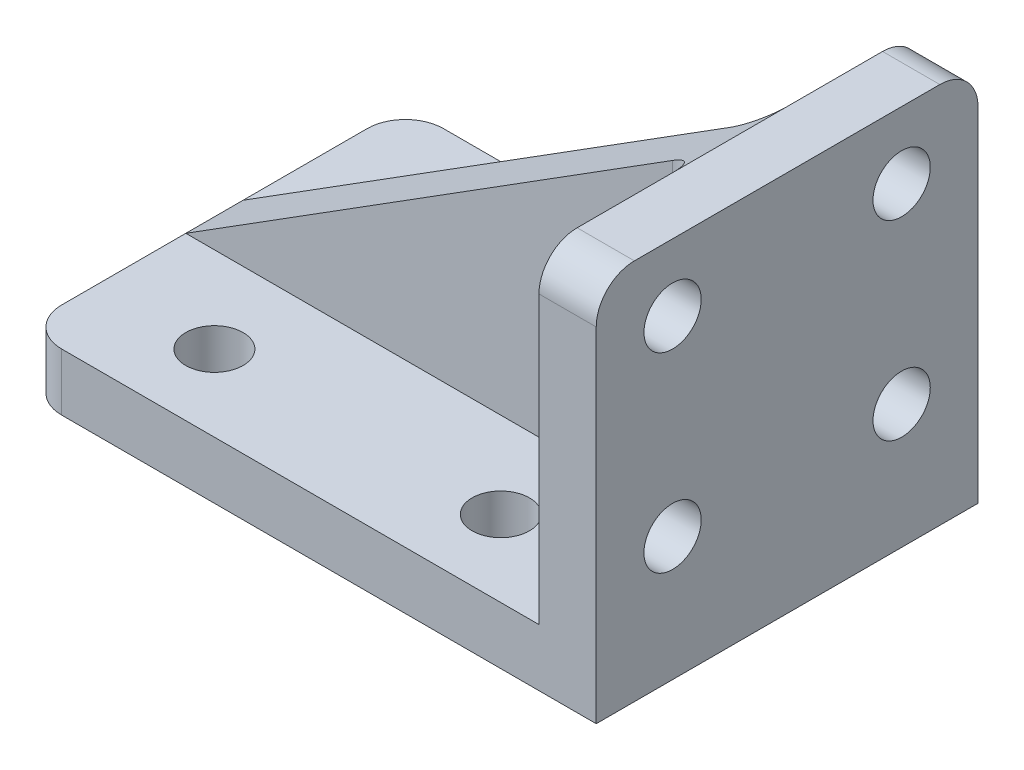
ISO-10303-21;
HEADER;
FILE_DESCRIPTION(('STEP AP214'),'2;1');
FILE_NAME('part.step','',(''),(''),'','','');
FILE_SCHEMA(('AUTOMOTIVE_DESIGN { 1 0 10303 214 1 1 1 1 }'));
ENDSEC;
DATA;
#1=APPLICATION_CONTEXT('core data for automotive mechanical design processes');
#2=APPLICATION_PROTOCOL_DEFINITION('international standard','automotive_design',2000,#1);
#3=PRODUCT_CONTEXT('',#1,'mechanical');
#4=PRODUCT('Part','Part','',(#3));
#5=PRODUCT_RELATED_PRODUCT_CATEGORY('part','',(#4));
#6=PRODUCT_DEFINITION_FORMATION('','',#4);
#7=PRODUCT_DEFINITION_CONTEXT('part definition',#1,'design');
#8=PRODUCT_DEFINITION('design','',#6,#7);
#9=PRODUCT_DEFINITION_SHAPE('','',#8);
#10=(LENGTH_UNIT() NAMED_UNIT(*) SI_UNIT(.MILLI.,.METRE.));
#11=(NAMED_UNIT(*) PLANE_ANGLE_UNIT() SI_UNIT($,.RADIAN.));
#12=(NAMED_UNIT(*) SI_UNIT($,.STERADIAN.) SOLID_ANGLE_UNIT());
#13=UNCERTAINTY_MEASURE_WITH_UNIT(LENGTH_MEASURE(1.E-05),#10,'distance_accuracy_value','');
#14=(GEOMETRIC_REPRESENTATION_CONTEXT(3) GLOBAL_UNCERTAINTY_ASSIGNED_CONTEXT((#13)) GLOBAL_UNIT_ASSIGNED_CONTEXT((#10,
#11,#12)) REPRESENTATION_CONTEXT('',''));
#15=CARTESIAN_POINT('',(0.,0.,0.));
#16=DIRECTION('',(0.,0.,1.));
#17=DIRECTION('',(1.,0.,0.));
#18=AXIS2_PLACEMENT_3D('',#15,#16,#17);
#19=CARTESIAN_POINT('',(0.,3.,0.));
#20=DIRECTION('',(0.,-1.,0.));
#21=DIRECTION('',(0.,0.,-1.));
#22=AXIS2_PLACEMENT_3D('',#19,#20,#21);
#23=PLANE('',#22);
#24=CARTESIAN_POINT('',(6.,3.,-4.));
#25=DIRECTION('',(0.,1.,0.));
#26=DIRECTION('',(0.,0.,-1.));
#27=AXIS2_PLACEMENT_3D('',#24,#25,#26);
#28=CIRCLE('',#27,1.5);
#29=CARTESIAN_POINT('',(6.,3.,-5.5));
#30=VERTEX_POINT('',#29);
#31=EDGE_CURVE('E356',#30,#30,#28,.T.);
#32=ORIENTED_EDGE('',*,*,#31,.F.);
#33=EDGE_LOOP('',(#32));
#34=FACE_BOUND('',#33,.T.);
#35=CARTESIAN_POINT('',(21.,3.,-4.));
#36=DIRECTION('',(0.,1.,0.));
#37=DIRECTION('',(0.,0.,1.));
#38=AXIS2_PLACEMENT_3D('',#35,#36,#37);
#39=CIRCLE('',#38,1.5);
#40=CARTESIAN_POINT('',(21.,3.,-2.5));
#41=VERTEX_POINT('',#40);
#42=EDGE_CURVE('E363',#41,#41,#39,.T.);
#43=ORIENTED_EDGE('',*,*,#42,.F.);
#44=EDGE_LOOP('',(#43));
#45=FACE_BOUND('',#44,.T.);
#46=DIRECTION('',(0.,0.,1.));
#47=VECTOR('',#46,1.);
#48=CARTESIAN_POINT('',(0.,3.,0.));
#49=LINE('',#48,#47);
#50=CARTESIAN_POINT('',(0.,3.,-8.5));
#51=VERTEX_POINT('',#50);
#52=CARTESIAN_POINT('',(0.,3.,-2.));
#53=VERTEX_POINT('',#52);
#54=EDGE_CURVE('E166',#51,#53,#49,.T.);
#55=ORIENTED_EDGE('',*,*,#54,.T.);
#56=CARTESIAN_POINT('',(2.,3.,-2.));
#57=DIRECTION('',(0.,-1.,0.));
#58=DIRECTION('',(0.,0.,-1.));
#59=AXIS2_PLACEMENT_3D('',#56,#57,#58);
#60=CIRCLE('',#59,2.);
#61=CARTESIAN_POINT('',(2.,3.,0.));
#62=VERTEX_POINT('',#61);
#63=EDGE_CURVE('E11',#53,#62,#60,.F.);
#64=ORIENTED_EDGE('',*,*,#63,.T.);
#65=DIRECTION('',(1.,0.,0.));
#66=VECTOR('',#65,1.);
#67=CARTESIAN_POINT('',(0.,3.,0.));
#68=LINE('',#67,#66);
#69=CARTESIAN_POINT('',(27.,3.,0.));
#70=VERTEX_POINT('',#69);
#71=EDGE_CURVE('E176',#62,#70,#68,.T.);
#72=ORIENTED_EDGE('',*,*,#71,.T.);
#73=DIRECTION('',(0.,0.,-1.));
#74=VECTOR('',#73,1.);
#75=CARTESIAN_POINT('',(27.,3.,0.));
#76=LINE('',#75,#74);
#77=CARTESIAN_POINT('',(27.,3.,-7.));
#78=VERTEX_POINT('',#77);
#79=EDGE_CURVE('E276',#70,#78,#76,.T.);
#80=ORIENTED_EDGE('',*,*,#79,.T.);
#81=CARTESIAN_POINT('',(25.5,3.,-7.));
#82=DIRECTION('',(0.,-1.,0.));
#83=DIRECTION('',(0.,0.,-1.));
#84=AXIS2_PLACEMENT_3D('',#81,#82,#83);
#85=CIRCLE('',#84,1.5);
#86=CARTESIAN_POINT('',(25.5,3.,-8.5));
#87=VERTEX_POINT('',#86);
#88=EDGE_CURVE('E170',#78,#87,#85,.F.);
#89=ORIENTED_EDGE('',*,*,#88,.T.);
#90=DIRECTION('',(1.,0.,0.));
#91=VECTOR('',#90,1.);
#92=CARTESIAN_POINT('',(0.,3.,-8.5));
#93=LINE('',#92,#91);
#94=EDGE_CURVE('E148',#51,#87,#93,.T.);
#95=ORIENTED_EDGE('',*,*,#94,.F.);
#96=EDGE_LOOP('',(#55,#64,#72,#80,#89,#95));
#97=FACE_BOUND('',#96,.T.);
#98=ADVANCED_FACE('F35',(#34,#45,#97),#23,.F.);
#99=CARTESIAN_POINT('',(27.,0.,0.));
#100=DIRECTION('',(-1.,0.,0.));
#101=DIRECTION('',(0.,0.,1.));
#102=AXIS2_PLACEMENT_3D('',#99,#100,#101);
#103=PLANE('',#102);
#104=CARTESIAN_POINT('',(27.,16.5,-4.));
#105=DIRECTION('',(-1.,0.,0.));
#106=DIRECTION('',(0.,0.,-1.));
#107=AXIS2_PLACEMENT_3D('',#104,#105,#106);
#108=CIRCLE('',#107,1.5);
#109=CARTESIAN_POINT('',(27.,16.5,-5.5));
#110=VERTEX_POINT('',#109);
#111=EDGE_CURVE('E376',#110,#110,#108,.T.);
#112=ORIENTED_EDGE('',*,*,#111,.F.);
#113=EDGE_LOOP('',(#112));
#114=FACE_BOUND('',#113,.T.);
#115=CARTESIAN_POINT('',(27.,6.5,-4.));
#116=DIRECTION('',(-1.,0.,0.));
#117=DIRECTION('',(0.,0.,1.));
#118=AXIS2_PLACEMENT_3D('',#115,#116,#117);
#119=CIRCLE('',#118,1.5);
#120=CARTESIAN_POINT('',(27.,6.5,-2.5));
#121=VERTEX_POINT('',#120);
#122=EDGE_CURVE('E382',#121,#121,#119,.T.);
#123=ORIENTED_EDGE('',*,*,#122,.F.);
#124=EDGE_LOOP('',(#123));
#125=FACE_BOUND('',#124,.T.);
#126=DIRECTION('',(0.,-1.,0.));
#127=VECTOR('',#126,1.);
#128=CARTESIAN_POINT('',(27.,3.,0.));
#129=LINE('',#128,#127);
#130=CARTESIAN_POINT('',(27.,18.,0.));
#131=VERTEX_POINT('',#130);
#132=EDGE_CURVE('E277',#131,#70,#129,.T.);
#133=ORIENTED_EDGE('',*,*,#132,.F.);
#134=CARTESIAN_POINT('',(27.,18.,-2.));
#135=DIRECTION('',(-1.,0.,0.));
#136=DIRECTION('',(0.,0.,1.));
#137=AXIS2_PLACEMENT_3D('',#134,#135,#136);
#138=CIRCLE('',#137,2.);
#139=CARTESIAN_POINT('',(27.,20.,-2.));
#140=VERTEX_POINT('',#139);
#141=EDGE_CURVE('E234',#131,#140,#138,.T.);
#142=ORIENTED_EDGE('',*,*,#141,.T.);
#143=DIRECTION('',(0.,0.,1.));
#144=VECTOR('',#143,1.);
#145=CARTESIAN_POINT('',(27.,20.,0.));
#146=LINE('',#145,#144);
#147=CARTESIAN_POINT('',(27.,20.,-7.));
#148=VERTEX_POINT('',#147);
#149=EDGE_CURVE('E283',#148,#140,#146,.T.);
#150=ORIENTED_EDGE('',*,*,#149,.F.);
#151=DIRECTION('',(0.,1.,0.));
#152=VECTOR('',#151,1.);
#153=CARTESIAN_POINT('',(27.,0.,-7.));
#154=LINE('',#153,#152);
#155=EDGE_CURVE('E199',#148,#78,#154,.F.);
#156=ORIENTED_EDGE('',*,*,#155,.T.);
#157=ORIENTED_EDGE('',*,*,#79,.F.);
#158=EDGE_LOOP('',(#133,#142,#150,#156,#157));
#159=FACE_BOUND('',#158,.T.);
#160=ADVANCED_FACE('F320',(#114,#125,#159),#103,.T.);
#161=CARTESIAN_POINT('',(0.,3.,0.));
#162=DIRECTION('',(1.,0.,0.));
#163=DIRECTION('',(0.,0.,-1.));
#164=AXIS2_PLACEMENT_3D('',#161,#162,#163);
#165=PLANE('',#164);
#166=CARTESIAN_POINT('',(0.,3.,-18.));
#167=VERTEX_POINT('',#166);
#168=CARTESIAN_POINT('',(0.,3.,-11.5));
#169=VERTEX_POINT('',#168);
#170=EDGE_CURVE('E173',#167,#169,#49,.T.);
#171=ORIENTED_EDGE('',*,*,#170,.F.);
#172=DIRECTION('',(0.,-1.,0.));
#173=VECTOR('',#172,1.);
#174=CARTESIAN_POINT('',(0.,3.,-18.));
#175=LINE('',#174,#173);
#176=CARTESIAN_POINT('',(0.,0.,-18.));
#177=VERTEX_POINT('',#176);
#178=EDGE_CURVE('E237',#167,#177,#175,.T.);
#179=ORIENTED_EDGE('',*,*,#178,.T.);
#180=DIRECTION('',(0.,0.,1.));
#181=VECTOR('',#180,1.);
#182=CARTESIAN_POINT('',(0.,0.,0.));
#183=LINE('',#182,#181);
#184=CARTESIAN_POINT('',(0.,0.,-2.));
#185=VERTEX_POINT('',#184);
#186=EDGE_CURVE('E187',#177,#185,#183,.T.);
#187=ORIENTED_EDGE('',*,*,#186,.T.);
#188=DIRECTION('',(0.,-1.,0.));
#189=VECTOR('',#188,1.);
#190=CARTESIAN_POINT('',(0.,3.,-2.));
#191=LINE('',#190,#189);
#192=EDGE_CURVE('E57',#185,#53,#191,.F.);
#193=ORIENTED_EDGE('',*,*,#192,.T.);
#194=ORIENTED_EDGE('',*,*,#54,.F.);
#195=DIRECTION('',(0.,0.,1.));
#196=VECTOR('',#195,1.);
#197=CARTESIAN_POINT('',(0.,3.,-11.5));
#198=LINE('',#197,#196);
#199=EDGE_CURVE('E157',#169,#51,#198,.T.);
#200=ORIENTED_EDGE('',*,*,#199,.F.);
#201=EDGE_LOOP('',(#171,#179,#187,#193,#194,#200));
#202=FACE_BOUND('',#201,.T.);
#203=ADVANCED_FACE('F172',(#202),#165,.F.);
#204=CARTESIAN_POINT('',(0.,3.,0.));
#205=DIRECTION('',(0.,0.,-1.));
#206=DIRECTION('',(-1.,0.,0.));
#207=AXIS2_PLACEMENT_3D('',#204,#205,#206);
#208=PLANE('',#207);
#209=DIRECTION('',(0.,-1.,0.));
#210=VECTOR('',#209,1.);
#211=CARTESIAN_POINT('',(30.,3.,0.));
#212=LINE('',#211,#210);
#213=CARTESIAN_POINT('',(30.,18.,0.));
#214=VERTEX_POINT('',#213);
#215=CARTESIAN_POINT('',(30.,0.,0.));
#216=VERTEX_POINT('',#215);
#217=EDGE_CURVE('E195',#214,#216,#212,.T.);
#218=ORIENTED_EDGE('',*,*,#217,.F.);
#219=DIRECTION('',(1.,0.,0.));
#220=VECTOR('',#219,1.);
#221=CARTESIAN_POINT('',(27.,18.,0.));
#222=LINE('',#221,#220);
#223=EDGE_CURVE('E232',#214,#131,#222,.F.);
#224=ORIENTED_EDGE('',*,*,#223,.T.);
#225=ORIENTED_EDGE('',*,*,#132,.T.);
#226=ORIENTED_EDGE('',*,*,#71,.F.);
#227=DIRECTION('',(0.,-1.,0.));
#228=VECTOR('',#227,1.);
#229=CARTESIAN_POINT('',(2.,3.,0.));
#230=LINE('',#229,#228);
#231=CARTESIAN_POINT('',(2.,0.,0.));
#232=VERTEX_POINT('',#231);
#233=EDGE_CURVE('E229',#62,#232,#230,.T.);
#234=ORIENTED_EDGE('',*,*,#233,.T.);
#235=DIRECTION('',(1.,0.,0.));
#236=VECTOR('',#235,1.);
#237=CARTESIAN_POINT('',(0.,0.,0.));
#238=LINE('',#237,#236);
#239=EDGE_CURVE('E189',#232,#216,#238,.T.);
#240=ORIENTED_EDGE('',*,*,#239,.T.);
#241=EDGE_LOOP('',(#218,#224,#225,#226,#234,#240));
#242=FACE_BOUND('',#241,.T.);
#243=ADVANCED_FACE('F301',(#242),#208,.F.);
#244=CARTESIAN_POINT('',(30.,3.,0.));
#245=DIRECTION('',(-1.,0.,0.));
#246=DIRECTION('',(0.,0.,1.));
#247=AXIS2_PLACEMENT_3D('',#244,#245,#246);
#248=PLANE('',#247);
#249=CARTESIAN_POINT('',(30.,16.5,-4.));
#250=DIRECTION('',(-1.,0.,0.));
#251=DIRECTION('',(0.,0.,-1.));
#252=AXIS2_PLACEMENT_3D('',#249,#250,#251);
#253=CIRCLE('',#252,1.5);
#254=CARTESIAN_POINT('',(30.,16.5,-5.5));
#255=VERTEX_POINT('',#254);
#256=EDGE_CURVE('E379',#255,#255,#253,.T.);
#257=ORIENTED_EDGE('',*,*,#256,.T.);
#258=EDGE_LOOP('',(#257));
#259=FACE_BOUND('',#258,.T.);
#260=CARTESIAN_POINT('',(30.,6.5,-4.));
#261=DIRECTION('',(-1.,0.,0.));
#262=DIRECTION('',(0.,0.,1.));
#263=AXIS2_PLACEMENT_3D('',#260,#261,#262);
#264=CIRCLE('',#263,1.5);
#265=CARTESIAN_POINT('',(30.,6.5,-2.5));
#266=VERTEX_POINT('',#265);
#267=EDGE_CURVE('E385',#266,#266,#264,.T.);
#268=ORIENTED_EDGE('',*,*,#267,.T.);
#269=EDGE_LOOP('',(#268));
#270=FACE_BOUND('',#269,.T.);
#271=CARTESIAN_POINT('',(30.,6.5,-16.));
#272=DIRECTION('',(-1.,0.,0.));
#273=DIRECTION('',(0.,0.,-1.));
#274=AXIS2_PLACEMENT_3D('',#271,#272,#273);
#275=CIRCLE('',#274,1.5);
#276=CARTESIAN_POINT('',(30.,6.5,-17.5));
#277=VERTEX_POINT('',#276);
#278=EDGE_CURVE('E373',#277,#277,#275,.T.);
#279=ORIENTED_EDGE('',*,*,#278,.T.);
#280=EDGE_LOOP('',(#279));
#281=FACE_BOUND('',#280,.T.);
#282=CARTESIAN_POINT('',(30.,16.5,-16.));
#283=DIRECTION('',(-1.,0.,0.));
#284=DIRECTION('',(0.,0.,1.));
#285=AXIS2_PLACEMENT_3D('',#282,#283,#284);
#286=CIRCLE('',#285,1.5);
#287=CARTESIAN_POINT('',(30.,16.5,-14.5));
#288=VERTEX_POINT('',#287);
#289=EDGE_CURVE('E360',#288,#288,#286,.T.);
#290=ORIENTED_EDGE('',*,*,#289,.T.);
#291=EDGE_LOOP('',(#290));
#292=FACE_BOUND('',#291,.T.);
#293=DIRECTION('',(0.,-1.,0.));
#294=VECTOR('',#293,1.);
#295=CARTESIAN_POINT('',(30.,3.,-20.));
#296=LINE('',#295,#294);
#297=CARTESIAN_POINT('',(30.,18.,-20.));
#298=VERTEX_POINT('',#297);
#299=CARTESIAN_POINT('',(30.,0.,-20.));
#300=VERTEX_POINT('',#299);
#301=EDGE_CURVE('E186',#298,#300,#296,.T.);
#302=ORIENTED_EDGE('',*,*,#301,.F.);
#303=CARTESIAN_POINT('',(30.,18.,-18.));
#304=DIRECTION('',(-1.,0.,0.));
#305=DIRECTION('',(0.,0.,1.));
#306=AXIS2_PLACEMENT_3D('',#303,#304,#305);
#307=CIRCLE('',#306,2.);
#308=CARTESIAN_POINT('',(30.,20.,-18.));
#309=VERTEX_POINT('',#308);
#310=EDGE_CURVE('E220',#298,#309,#307,.F.);
#311=ORIENTED_EDGE('',*,*,#310,.T.);
#312=DIRECTION('',(0.,0.,1.));
#313=VECTOR('',#312,1.);
#314=CARTESIAN_POINT('',(30.,20.,0.));
#315=LINE('',#314,#313);
#316=CARTESIAN_POINT('',(30.,20.,-2.));
#317=VERTEX_POINT('',#316);
#318=EDGE_CURVE('E162',#309,#317,#315,.T.);
#319=ORIENTED_EDGE('',*,*,#318,.T.);
#320=CARTESIAN_POINT('',(30.,18.,-2.));
#321=DIRECTION('',(-1.,0.,0.));
#322=DIRECTION('',(0.,0.,1.));
#323=AXIS2_PLACEMENT_3D('',#320,#321,#322);
#324=CIRCLE('',#323,2.);
#325=EDGE_CURVE('E218',#317,#214,#324,.F.);
#326=ORIENTED_EDGE('',*,*,#325,.T.);
#327=ORIENTED_EDGE('',*,*,#217,.T.);
#328=DIRECTION('',(0.,0.,-1.));
#329=VECTOR('',#328,1.);
#330=CARTESIAN_POINT('',(30.,0.,0.));
#331=LINE('',#330,#329);
#332=EDGE_CURVE('E178',#216,#300,#331,.T.);
#333=ORIENTED_EDGE('',*,*,#332,.T.);
#334=EDGE_LOOP('',(#302,#311,#319,#326,#327,#333));
#335=FACE_BOUND('',#334,.T.);
#336=ADVANCED_FACE('F299',(#259,#270,#281,#292,#335),#248,.F.);
#337=CARTESIAN_POINT('',(0.,3.,-20.));
#338=DIRECTION('',(0.,0.,1.));
#339=DIRECTION('',(1.,0.,0.));
#340=AXIS2_PLACEMENT_3D('',#337,#338,#339);
#341=PLANE('',#340);
#342=DIRECTION('',(0.,1.,0.));
#343=VECTOR('',#342,1.);
#344=CARTESIAN_POINT('',(27.,3.,-20.));
#345=LINE('',#344,#343);
#346=CARTESIAN_POINT('',(27.,3.,-20.));
#347=VERTEX_POINT('',#346);
#348=CARTESIAN_POINT('',(27.,18.,-20.));
#349=VERTEX_POINT('',#348);
#350=EDGE_CURVE('E275',#347,#349,#345,.T.);
#351=ORIENTED_EDGE('',*,*,#350,.T.);
#352=DIRECTION('',(1.,0.,0.));
#353=VECTOR('',#352,1.);
#354=CARTESIAN_POINT('',(30.,18.,-20.));
#355=LINE('',#354,#353);
#356=EDGE_CURVE('E215',#349,#298,#355,.T.);
#357=ORIENTED_EDGE('',*,*,#356,.T.);
#358=ORIENTED_EDGE('',*,*,#301,.T.);
#359=DIRECTION('',(-1.,0.,0.));
#360=VECTOR('',#359,1.);
#361=CARTESIAN_POINT('',(0.,0.,-20.));
#362=LINE('',#361,#360);
#363=CARTESIAN_POINT('',(2.,0.,-20.));
#364=VERTEX_POINT('',#363);
#365=EDGE_CURVE('E174',#300,#364,#362,.T.);
#366=ORIENTED_EDGE('',*,*,#365,.T.);
#367=DIRECTION('',(0.,-1.,0.));
#368=VECTOR('',#367,1.);
#369=CARTESIAN_POINT('',(2.,3.,-20.));
#370=LINE('',#369,#368);
#371=CARTESIAN_POINT('',(2.,3.,-20.));
#372=VERTEX_POINT('',#371);
#373=EDGE_CURVE('E213',#364,#372,#370,.F.);
#374=ORIENTED_EDGE('',*,*,#373,.T.);
#375=DIRECTION('',(-1.,0.,0.));
#376=VECTOR('',#375,1.);
#377=CARTESIAN_POINT('',(0.,3.,-20.));
#378=LINE('',#377,#376);
#379=EDGE_CURVE('E184',#347,#372,#378,.T.);
#380=ORIENTED_EDGE('',*,*,#379,.F.);
#381=EDGE_LOOP('',(#351,#357,#358,#366,#374,#380));
#382=FACE_BOUND('',#381,.T.);
#383=ADVANCED_FACE('F253',(#382),#341,.F.);
#384=CARTESIAN_POINT('',(21.,3.,-16.));
#385=DIRECTION('',(0.,1.,0.));
#386=DIRECTION('',(0.,0.,-1.));
#387=AXIS2_PLACEMENT_3D('',#384,#385,#386);
#388=CIRCLE('',#387,1.5);
#389=CARTESIAN_POINT('',(21.,3.,-17.5));
#390=VERTEX_POINT('',#389);
#391=EDGE_CURVE('E343',#390,#390,#388,.T.);
#392=ORIENTED_EDGE('',*,*,#391,.F.);
#393=EDGE_LOOP('',(#392));
#394=FACE_BOUND('',#393,.T.);
#395=CARTESIAN_POINT('',(6.,3.,-16.));
#396=DIRECTION('',(0.,1.,0.));
#397=DIRECTION('',(0.,0.,1.));
#398=AXIS2_PLACEMENT_3D('',#395,#396,#397);
#399=CIRCLE('',#398,1.5);
#400=CARTESIAN_POINT('',(6.,3.,-14.5));
#401=VERTEX_POINT('',#400);
#402=EDGE_CURVE('E346',#401,#401,#399,.T.);
#403=ORIENTED_EDGE('',*,*,#402,.F.);
#404=EDGE_LOOP('',(#403));
#405=FACE_BOUND('',#404,.T.);
#406=ORIENTED_EDGE('',*,*,#379,.T.);
#407=CARTESIAN_POINT('',(2.,3.,-18.));
#408=DIRECTION('',(0.,-1.,0.));
#409=DIRECTION('',(0.,0.,-1.));
#410=AXIS2_PLACEMENT_3D('',#407,#408,#409);
#411=CIRCLE('',#410,2.);
#412=EDGE_CURVE('E43',#372,#167,#411,.F.);
#413=ORIENTED_EDGE('',*,*,#412,.T.);
#414=ORIENTED_EDGE('',*,*,#170,.T.);
#415=DIRECTION('',(1.,0.,0.));
#416=VECTOR('',#415,1.);
#417=CARTESIAN_POINT('',(0.,3.,-11.5));
#418=LINE('',#417,#416);
#419=CARTESIAN_POINT('',(25.5,3.,-11.5));
#420=VERTEX_POINT('',#419);
#421=EDGE_CURVE('E259',#169,#420,#418,.T.);
#422=ORIENTED_EDGE('',*,*,#421,.T.);
#423=CARTESIAN_POINT('',(25.5,3.,-13.));
#424=DIRECTION('',(0.,-1.,0.));
#425=DIRECTION('',(0.,0.,-1.));
#426=AXIS2_PLACEMENT_3D('',#423,#424,#425);
#427=CIRCLE('',#426,1.5);
#428=CARTESIAN_POINT('',(27.,3.,-13.));
#429=VERTEX_POINT('',#428);
#430=EDGE_CURVE('E207',#420,#429,#427,.F.);
#431=ORIENTED_EDGE('',*,*,#430,.T.);
#432=EDGE_CURVE('E274',#429,#347,#76,.T.);
#433=ORIENTED_EDGE('',*,*,#432,.T.);
#434=EDGE_LOOP('',(#406,#413,#414,#422,#431,#433));
#435=FACE_BOUND('',#434,.T.);
#436=ADVANCED_FACE('F258',(#394,#405,#435),#23,.F.);
#437=CARTESIAN_POINT('',(0.,0.,0.));
#438=DIRECTION('',(0.,-1.,0.));
#439=DIRECTION('',(0.,0.,-1.));
#440=AXIS2_PLACEMENT_3D('',#437,#438,#439);
#441=PLANE('',#440);
#442=CARTESIAN_POINT('',(6.,0.,-4.));
#443=DIRECTION('',(0.,1.,0.));
#444=DIRECTION('',(0.,0.,-1.));
#445=AXIS2_PLACEMENT_3D('',#442,#443,#444);
#446=CIRCLE('',#445,1.5);
#447=CARTESIAN_POINT('',(6.,0.,-5.5));
#448=VERTEX_POINT('',#447);
#449=EDGE_CURVE('E359',#448,#448,#446,.T.);
#450=ORIENTED_EDGE('',*,*,#449,.T.);
#451=EDGE_LOOP('',(#450));
#452=FACE_BOUND('',#451,.T.);
#453=CARTESIAN_POINT('',(21.,0.,-4.));
#454=DIRECTION('',(0.,1.,0.));
#455=DIRECTION('',(0.,0.,1.));
#456=AXIS2_PLACEMENT_3D('',#453,#454,#455);
#457=CIRCLE('',#456,1.5);
#458=CARTESIAN_POINT('',(21.,0.,-2.5));
#459=VERTEX_POINT('',#458);
#460=EDGE_CURVE('E366',#459,#459,#457,.T.);
#461=ORIENTED_EDGE('',*,*,#460,.T.);
#462=EDGE_LOOP('',(#461));
#463=FACE_BOUND('',#462,.T.);
#464=CARTESIAN_POINT('',(21.,0.,-16.));
#465=DIRECTION('',(0.,1.,0.));
#466=DIRECTION('',(0.,0.,-1.));
#467=AXIS2_PLACEMENT_3D('',#464,#465,#466);
#468=CIRCLE('',#467,1.5);
#469=CARTESIAN_POINT('',(21.,0.,-17.5));
#470=VERTEX_POINT('',#469);
#471=EDGE_CURVE('E348',#470,#470,#468,.T.);
#472=ORIENTED_EDGE('',*,*,#471,.T.);
#473=EDGE_LOOP('',(#472));
#474=FACE_BOUND('',#473,.T.);
#475=CARTESIAN_POINT('',(6.,0.,-16.));
#476=DIRECTION('',(0.,1.,0.));
#477=DIRECTION('',(0.,0.,1.));
#478=AXIS2_PLACEMENT_3D('',#475,#476,#477);
#479=CIRCLE('',#478,1.5);
#480=CARTESIAN_POINT('',(6.,0.,-14.5));
#481=VERTEX_POINT('',#480);
#482=EDGE_CURVE('E153',#481,#481,#479,.T.);
#483=ORIENTED_EDGE('',*,*,#482,.T.);
#484=EDGE_LOOP('',(#483));
#485=FACE_BOUND('',#484,.T.);
#486=ORIENTED_EDGE('',*,*,#186,.F.);
#487=CARTESIAN_POINT('',(2.,0.,-18.));
#488=DIRECTION('',(0.,-1.,0.));
#489=DIRECTION('',(0.,0.,-1.));
#490=AXIS2_PLACEMENT_3D('',#487,#488,#489);
#491=CIRCLE('',#490,2.);
#492=EDGE_CURVE('E242',#177,#364,#491,.T.);
#493=ORIENTED_EDGE('',*,*,#492,.T.);
#494=ORIENTED_EDGE('',*,*,#365,.F.);
#495=ORIENTED_EDGE('',*,*,#332,.F.);
#496=ORIENTED_EDGE('',*,*,#239,.F.);
#497=CARTESIAN_POINT('',(2.,0.,-2.));
#498=DIRECTION('',(0.,-1.,0.));
#499=DIRECTION('',(0.,0.,-1.));
#500=AXIS2_PLACEMENT_3D('',#497,#498,#499);
#501=CIRCLE('',#500,2.);
#502=EDGE_CURVE('E240',#232,#185,#501,.T.);
#503=ORIENTED_EDGE('',*,*,#502,.T.);
#504=EDGE_LOOP('',(#486,#493,#494,#495,#496,#503));
#505=FACE_BOUND('',#504,.T.);
#506=ADVANCED_FACE('F246',(#452,#463,#474,#485,#505),#441,.T.);
#507=CARTESIAN_POINT('',(27.,20.,0.));
#508=DIRECTION('',(0.,1.,0.));
#509=DIRECTION('',(0.,0.,1.));
#510=AXIS2_PLACEMENT_3D('',#507,#508,#509);
#511=PLANE('',#510);
#512=ORIENTED_EDGE('',*,*,#318,.F.);
#513=DIRECTION('',(1.,0.,0.));
#514=VECTOR('',#513,1.);
#515=CARTESIAN_POINT('',(27.,20.,-18.));
#516=LINE('',#515,#514);
#517=CARTESIAN_POINT('',(27.,20.,-18.));
#518=VERTEX_POINT('',#517);
#519=EDGE_CURVE('E225',#309,#518,#516,.F.);
#520=ORIENTED_EDGE('',*,*,#519,.T.);
#521=CARTESIAN_POINT('',(27.,20.,-13.));
#522=VERTEX_POINT('',#521);
#523=EDGE_CURVE('E190',#518,#522,#146,.T.);
#524=ORIENTED_EDGE('',*,*,#523,.T.);
#525=DIRECTION('',(0.,0.,1.));
#526=VECTOR('',#525,1.);
#527=CARTESIAN_POINT('',(27.,20.,-11.5));
#528=LINE('',#527,#526);
#529=EDGE_CURVE('E163',#522,#148,#528,.T.);
#530=ORIENTED_EDGE('',*,*,#529,.T.);
#531=ORIENTED_EDGE('',*,*,#149,.T.);
#532=DIRECTION('',(1.,0.,0.));
#533=VECTOR('',#532,1.);
#534=CARTESIAN_POINT('',(30.,20.,-2.));
#535=LINE('',#534,#533);
#536=EDGE_CURVE('E222',#140,#317,#535,.T.);
#537=ORIENTED_EDGE('',*,*,#536,.T.);
#538=EDGE_LOOP('',(#512,#520,#524,#530,#531,#537));
#539=FACE_BOUND('',#538,.T.);
#540=ADVANCED_FACE('F290',(#539),#511,.T.);
#541=CARTESIAN_POINT('',(27.,6.5,-16.));
#542=DIRECTION('',(-1.,0.,0.));
#543=DIRECTION('',(0.,0.,-1.));
#544=AXIS2_PLACEMENT_3D('',#541,#542,#543);
#545=CIRCLE('',#544,1.5);
#546=CARTESIAN_POINT('',(27.,6.5,-17.5));
#547=VERTEX_POINT('',#546);
#548=EDGE_CURVE('E388',#547,#547,#545,.T.);
#549=ORIENTED_EDGE('',*,*,#548,.F.);
#550=EDGE_LOOP('',(#549));
#551=FACE_BOUND('',#550,.T.);
#552=CARTESIAN_POINT('',(27.,16.5,-16.));
#553=DIRECTION('',(-1.,0.,0.));
#554=DIRECTION('',(0.,0.,1.));
#555=AXIS2_PLACEMENT_3D('',#552,#553,#554);
#556=CIRCLE('',#555,1.5);
#557=CARTESIAN_POINT('',(27.,16.5,-14.5));
#558=VERTEX_POINT('',#557);
#559=EDGE_CURVE('E370',#558,#558,#556,.T.);
#560=ORIENTED_EDGE('',*,*,#559,.F.);
#561=EDGE_LOOP('',(#560));
#562=FACE_BOUND('',#561,.T.);
#563=ORIENTED_EDGE('',*,*,#523,.F.);
#564=CARTESIAN_POINT('',(27.,18.,-18.));
#565=DIRECTION('',(-1.,0.,0.));
#566=DIRECTION('',(0.,0.,1.));
#567=AXIS2_PLACEMENT_3D('',#564,#565,#566);
#568=CIRCLE('',#567,2.);
#569=EDGE_CURVE('E227',#518,#349,#568,.T.);
#570=ORIENTED_EDGE('',*,*,#569,.T.);
#571=ORIENTED_EDGE('',*,*,#350,.F.);
#572=ORIENTED_EDGE('',*,*,#432,.F.);
#573=DIRECTION('',(0.,1.,0.));
#574=VECTOR('',#573,1.);
#575=CARTESIAN_POINT('',(27.,20.,-13.));
#576=LINE('',#575,#574);
#577=EDGE_CURVE('E202',#429,#522,#576,.T.);
#578=ORIENTED_EDGE('',*,*,#577,.T.);
#579=EDGE_LOOP('',(#563,#570,#571,#572,#578));
#580=FACE_BOUND('',#579,.T.);
#581=ADVANCED_FACE('F271',(#551,#562,#580),#103,.T.);
#582=CARTESIAN_POINT('',(27.,20.,-11.5));
#583=DIRECTION('',(-0.532813269686139,0.846232840089751,0.));
#584=DIRECTION('',(-0.846232840089751,-0.532813269686139,0.));
#585=AXIS2_PLACEMENT_3D('',#582,#583,#584);
#586=PLANE('',#585);
#587=ORIENTED_EDGE('',*,*,#199,.T.);
#588=DIRECTION('',(-0.846232840089751,-0.532813269686139,0.));
#589=VECTOR('',#588,1.);
#590=CARTESIAN_POINT('',(27.,20.,-8.5));
#591=LINE('',#590,#589);
#592=CARTESIAN_POINT('',(25.5,19.0555555555556,-8.5));
#593=VERTEX_POINT('',#592);
#594=EDGE_CURVE('E144',#593,#51,#591,.T.);
#595=ORIENTED_EDGE('',*,*,#594,.F.);
#596=CARTESIAN_POINT('',(25.5,19.0555555555556,-7.));
#597=DIRECTION('',(-0.532813269686139,0.846232840089751,0.));
#598=DIRECTION('',(0.846232840089751,0.532813269686139,0.));
#599=AXIS2_PLACEMENT_3D('',#596,#597,#598);
#600=ELLIPSE('',#599,1.77256179261598,1.5);
#601=EDGE_CURVE('E209',#593,#148,#600,.F.);
#602=ORIENTED_EDGE('',*,*,#601,.T.);
#603=ORIENTED_EDGE('',*,*,#529,.F.);
#604=CARTESIAN_POINT('',(25.5,19.0555555555556,-13.));
#605=DIRECTION('',(-0.532813269686139,0.846232840089751,0.));
#606=DIRECTION('',(-0.846232840089751,-0.532813269686139,0.));
#607=AXIS2_PLACEMENT_3D('',#604,#605,#606);
#608=ELLIPSE('',#607,1.77256179261598,1.5);
#609=CARTESIAN_POINT('',(25.5,19.0555555555556,-11.5));
#610=VERTEX_POINT('',#609);
#611=EDGE_CURVE('E211',#522,#610,#608,.F.);
#612=ORIENTED_EDGE('',*,*,#611,.T.);
#613=DIRECTION('',(-0.846232840089751,-0.532813269686139,0.));
#614=VECTOR('',#613,1.);
#615=CARTESIAN_POINT('',(27.,20.,-11.5));
#616=LINE('',#615,#614);
#617=EDGE_CURVE('E160',#610,#169,#616,.T.);
#618=ORIENTED_EDGE('',*,*,#617,.T.);
#619=EDGE_LOOP('',(#587,#595,#602,#603,#612,#618));
#620=FACE_BOUND('',#619,.T.);
#621=ADVANCED_FACE('F158',(#620),#586,.T.);
#622=CARTESIAN_POINT('',(0.,0.,-11.5));
#623=DIRECTION('',(0.,0.,-1.));
#624=DIRECTION('',(-1.,0.,0.));
#625=AXIS2_PLACEMENT_3D('',#622,#623,#624);
#626=PLANE('',#625);
#627=ORIENTED_EDGE('',*,*,#617,.F.);
#628=DIRECTION('',(0.,1.,0.));
#629=VECTOR('',#628,1.);
#630=CARTESIAN_POINT('',(25.5,3.,-11.5));
#631=LINE('',#630,#629);
#632=EDGE_CURVE('E205',#610,#420,#631,.F.);
#633=ORIENTED_EDGE('',*,*,#632,.T.);
#634=ORIENTED_EDGE('',*,*,#421,.F.);
#635=EDGE_LOOP('',(#627,#633,#634));
#636=FACE_BOUND('',#635,.T.);
#637=ADVANCED_FACE('F436',(#636),#626,.T.);
#638=CARTESIAN_POINT('',(0.,0.,-8.5));
#639=DIRECTION('',(0.,0.,-1.));
#640=DIRECTION('',(-1.,0.,0.));
#641=AXIS2_PLACEMENT_3D('',#638,#639,#640);
#642=PLANE('',#641);
#643=ORIENTED_EDGE('',*,*,#94,.T.);
#644=DIRECTION('',(0.,1.,0.));
#645=VECTOR('',#644,1.);
#646=CARTESIAN_POINT('',(25.5,0.,-8.5));
#647=LINE('',#646,#645);
#648=EDGE_CURVE('E150',#87,#593,#647,.T.);
#649=ORIENTED_EDGE('',*,*,#648,.T.);
#650=ORIENTED_EDGE('',*,*,#594,.T.);
#651=EDGE_LOOP('',(#643,#649,#650));
#652=FACE_BOUND('',#651,.T.);
#653=ADVANCED_FACE('F146',(#652),#642,.F.);
#654=CARTESIAN_POINT('',(6.,0.,-16.));
#655=DIRECTION('',(0.,1.,0.));
#656=DIRECTION('',(0.,0.,1.));
#657=AXIS2_PLACEMENT_3D('',#654,#655,#656);
#658=CYLINDRICAL_SURFACE('',#657,1.5);
#659=ORIENTED_EDGE('',*,*,#482,.F.);
#660=EDGE_LOOP('',(#659));
#661=FACE_BOUND('',#660,.T.);
#662=ORIENTED_EDGE('',*,*,#402,.T.);
#663=EDGE_LOOP('',(#662));
#664=FACE_BOUND('',#663,.T.);
#665=ADVANCED_FACE('F426',(#661,#664),#658,.F.);
#666=CARTESIAN_POINT('',(21.,0.,-16.));
#667=DIRECTION('',(0.,1.,0.));
#668=DIRECTION('',(0.,0.,1.));
#669=AXIS2_PLACEMENT_3D('',#666,#667,#668);
#670=CYLINDRICAL_SURFACE('',#669,1.5);
#671=ORIENTED_EDGE('',*,*,#471,.F.);
#672=EDGE_LOOP('',(#671));
#673=FACE_BOUND('',#672,.T.);
#674=ORIENTED_EDGE('',*,*,#391,.T.);
#675=EDGE_LOOP('',(#674));
#676=FACE_BOUND('',#675,.T.);
#677=ADVANCED_FACE('F423',(#673,#676),#670,.F.);
#678=CARTESIAN_POINT('',(21.,0.,-4.));
#679=DIRECTION('',(0.,1.,0.));
#680=DIRECTION('',(0.,0.,1.));
#681=AXIS2_PLACEMENT_3D('',#678,#679,#680);
#682=CYLINDRICAL_SURFACE('',#681,1.5);
#683=ORIENTED_EDGE('',*,*,#460,.F.);
#684=EDGE_LOOP('',(#683));
#685=FACE_BOUND('',#684,.T.);
#686=ORIENTED_EDGE('',*,*,#42,.T.);
#687=EDGE_LOOP('',(#686));
#688=FACE_BOUND('',#687,.T.);
#689=ADVANCED_FACE('F415',(#685,#688),#682,.F.);
#690=CARTESIAN_POINT('',(6.,0.,-4.));
#691=DIRECTION('',(0.,1.,0.));
#692=DIRECTION('',(0.,0.,1.));
#693=AXIS2_PLACEMENT_3D('',#690,#691,#692);
#694=CYLINDRICAL_SURFACE('',#693,1.5);
#695=ORIENTED_EDGE('',*,*,#449,.F.);
#696=EDGE_LOOP('',(#695));
#697=FACE_BOUND('',#696,.T.);
#698=ORIENTED_EDGE('',*,*,#31,.T.);
#699=EDGE_LOOP('',(#698));
#700=FACE_BOUND('',#699,.T.);
#701=ADVANCED_FACE('F409',(#697,#700),#694,.F.);
#702=CARTESIAN_POINT('',(30.,16.5,-16.));
#703=DIRECTION('',(-1.,0.,0.));
#704=DIRECTION('',(0.,0.,1.));
#705=AXIS2_PLACEMENT_3D('',#702,#703,#704);
#706=CYLINDRICAL_SURFACE('',#705,1.5);
#707=ORIENTED_EDGE('',*,*,#289,.F.);
#708=EDGE_LOOP('',(#707));
#709=FACE_BOUND('',#708,.T.);
#710=ORIENTED_EDGE('',*,*,#559,.T.);
#711=EDGE_LOOP('',(#710));
#712=FACE_BOUND('',#711,.T.);
#713=ADVANCED_FACE('F400',(#709,#712),#706,.F.);
#714=CARTESIAN_POINT('',(30.,6.5,-16.));
#715=DIRECTION('',(-1.,0.,0.));
#716=DIRECTION('',(0.,0.,1.));
#717=AXIS2_PLACEMENT_3D('',#714,#715,#716);
#718=CYLINDRICAL_SURFACE('',#717,1.5);
#719=ORIENTED_EDGE('',*,*,#278,.F.);
#720=EDGE_LOOP('',(#719));
#721=FACE_BOUND('',#720,.T.);
#722=ORIENTED_EDGE('',*,*,#548,.T.);
#723=EDGE_LOOP('',(#722));
#724=FACE_BOUND('',#723,.T.);
#725=ADVANCED_FACE('F396',(#721,#724),#718,.F.);
#726=CARTESIAN_POINT('',(30.,6.5,-4.));
#727=DIRECTION('',(-1.,0.,0.));
#728=DIRECTION('',(0.,0.,1.));
#729=AXIS2_PLACEMENT_3D('',#726,#727,#728);
#730=CYLINDRICAL_SURFACE('',#729,1.5);
#731=ORIENTED_EDGE('',*,*,#267,.F.);
#732=EDGE_LOOP('',(#731));
#733=FACE_BOUND('',#732,.T.);
#734=ORIENTED_EDGE('',*,*,#122,.T.);
#735=EDGE_LOOP('',(#734));
#736=FACE_BOUND('',#735,.T.);
#737=ADVANCED_FACE('F399',(#733,#736),#730,.F.);
#738=CARTESIAN_POINT('',(30.,16.5,-4.));
#739=DIRECTION('',(-1.,0.,0.));
#740=DIRECTION('',(0.,0.,1.));
#741=AXIS2_PLACEMENT_3D('',#738,#739,#740);
#742=CYLINDRICAL_SURFACE('',#741,1.5);
#743=ORIENTED_EDGE('',*,*,#256,.F.);
#744=EDGE_LOOP('',(#743));
#745=FACE_BOUND('',#744,.T.);
#746=ORIENTED_EDGE('',*,*,#111,.T.);
#747=EDGE_LOOP('',(#746));
#748=FACE_BOUND('',#747,.T.);
#749=ADVANCED_FACE('F421',(#745,#748),#742,.F.);
#750=CARTESIAN_POINT('',(25.5,0.,-7.));
#751=DIRECTION('',(0.,1.,0.));
#752=DIRECTION('',(0.,0.,1.));
#753=AXIS2_PLACEMENT_3D('',#750,#751,#752);
#754=CYLINDRICAL_SURFACE('',#753,1.5);
#755=ORIENTED_EDGE('',*,*,#88,.F.);
#756=ORIENTED_EDGE('',*,*,#155,.F.);
#757=ORIENTED_EDGE('',*,*,#601,.F.);
#758=ORIENTED_EDGE('',*,*,#648,.F.);
#759=EDGE_LOOP('',(#755,#756,#757,#758));
#760=FACE_BOUND('',#759,.T.);
#761=ADVANCED_FACE('F317',(#760),#754,.F.);
#762=CARTESIAN_POINT('',(25.5,0.,-13.));
#763=DIRECTION('',(0.,-1.,0.));
#764=DIRECTION('',(0.,0.,-1.));
#765=AXIS2_PLACEMENT_3D('',#762,#763,#764);
#766=CYLINDRICAL_SURFACE('',#765,1.5);
#767=ORIENTED_EDGE('',*,*,#430,.F.);
#768=ORIENTED_EDGE('',*,*,#632,.F.);
#769=ORIENTED_EDGE('',*,*,#611,.F.);
#770=ORIENTED_EDGE('',*,*,#577,.F.);
#771=EDGE_LOOP('',(#767,#768,#769,#770));
#772=FACE_BOUND('',#771,.T.);
#773=ADVANCED_FACE('F267',(#772),#766,.F.);
#774=CARTESIAN_POINT('',(0.,18.,-18.));
#775=DIRECTION('',(-1.,0.,0.));
#776=DIRECTION('',(0.,0.,1.));
#777=AXIS2_PLACEMENT_3D('',#774,#775,#776);
#778=CYLINDRICAL_SURFACE('',#777,2.);
#779=ORIENTED_EDGE('',*,*,#569,.F.);
#780=ORIENTED_EDGE('',*,*,#519,.F.);
#781=ORIENTED_EDGE('',*,*,#310,.F.);
#782=ORIENTED_EDGE('',*,*,#356,.F.);
#783=EDGE_LOOP('',(#779,#780,#781,#782));
#784=FACE_BOUND('',#783,.T.);
#785=ADVANCED_FACE('F309',(#784),#778,.T.);
#786=CARTESIAN_POINT('',(27.,18.,-2.));
#787=DIRECTION('',(-1.,0.,0.));
#788=DIRECTION('',(0.,0.,1.));
#789=AXIS2_PLACEMENT_3D('',#786,#787,#788);
#790=CYLINDRICAL_SURFACE('',#789,2.);
#791=ORIENTED_EDGE('',*,*,#141,.F.);
#792=ORIENTED_EDGE('',*,*,#223,.F.);
#793=ORIENTED_EDGE('',*,*,#325,.F.);
#794=ORIENTED_EDGE('',*,*,#536,.F.);
#795=EDGE_LOOP('',(#791,#792,#793,#794));
#796=FACE_BOUND('',#795,.T.);
#797=ADVANCED_FACE('F295',(#796),#790,.T.);
#798=CARTESIAN_POINT('',(2.,3.,-18.));
#799=DIRECTION('',(0.,-1.,0.));
#800=DIRECTION('',(0.,0.,-1.));
#801=AXIS2_PLACEMENT_3D('',#798,#799,#800);
#802=CYLINDRICAL_SURFACE('',#801,2.);
#803=ORIENTED_EDGE('',*,*,#412,.F.);
#804=ORIENTED_EDGE('',*,*,#373,.F.);
#805=ORIENTED_EDGE('',*,*,#492,.F.);
#806=ORIENTED_EDGE('',*,*,#178,.F.);
#807=EDGE_LOOP('',(#803,#804,#805,#806));
#808=FACE_BOUND('',#807,.T.);
#809=ADVANCED_FACE('F256',(#808),#802,.T.);
#810=CARTESIAN_POINT('',(2.,3.,-2.));
#811=DIRECTION('',(0.,-1.,0.));
#812=DIRECTION('',(0.,0.,-1.));
#813=AXIS2_PLACEMENT_3D('',#810,#811,#812);
#814=CYLINDRICAL_SURFACE('',#813,2.);
#815=ORIENTED_EDGE('',*,*,#63,.F.);
#816=ORIENTED_EDGE('',*,*,#192,.F.);
#817=ORIENTED_EDGE('',*,*,#502,.F.);
#818=ORIENTED_EDGE('',*,*,#233,.F.);
#819=EDGE_LOOP('',(#815,#816,#817,#818));
#820=FACE_BOUND('',#819,.T.);
#821=ADVANCED_FACE('F37',(#820),#814,.T.);
#822=CLOSED_SHELL('',(#98,#160,#203,#243,#336,#383,#436,#506,#540,#581,#621,#637,#653,#665,#677,
#689,#701,#713,#725,#737,#749,#761,#773,#785,#797,#809,#821));
#823=MANIFOLD_SOLID_BREP('B2',#822);
#824=ADVANCED_BREP_SHAPE_REPRESENTATION('',(#18,#823),#14);
#825=SHAPE_DEFINITION_REPRESENTATION(#9,#824);
ENDSEC;
END-ISO-10303-21;
